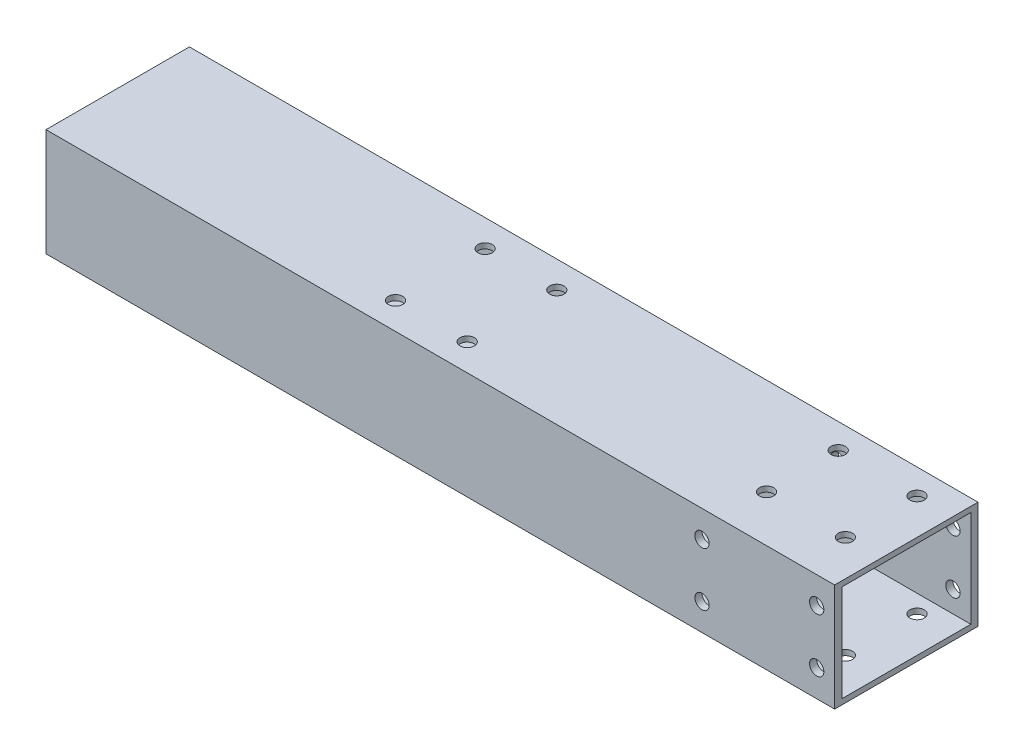
ISO-10303-21;
HEADER;
FILE_DESCRIPTION(('STEP AP214'),'2;1');
FILE_NAME('part.step','',(''),(''),'','','');
FILE_SCHEMA(('AUTOMOTIVE_DESIGN { 1 0 10303 214 1 1 1 1 }'));
ENDSEC;
DATA;
#1=APPLICATION_CONTEXT('core data for automotive mechanical design processes');
#2=APPLICATION_PROTOCOL_DEFINITION('international standard','automotive_design',2000,#1);
#3=PRODUCT_CONTEXT('',#1,'mechanical');
#4=PRODUCT('Part','Part','',(#3));
#5=PRODUCT_RELATED_PRODUCT_CATEGORY('part','',(#4));
#6=PRODUCT_DEFINITION_FORMATION('','',#4);
#7=PRODUCT_DEFINITION_CONTEXT('part definition',#1,'design');
#8=PRODUCT_DEFINITION('design','',#6,#7);
#9=PRODUCT_DEFINITION_SHAPE('','',#8);
#10=(LENGTH_UNIT() NAMED_UNIT(*) SI_UNIT(.MILLI.,.METRE.));
#11=(NAMED_UNIT(*) PLANE_ANGLE_UNIT() SI_UNIT($,.RADIAN.));
#12=(NAMED_UNIT(*) SI_UNIT($,.STERADIAN.) SOLID_ANGLE_UNIT());
#13=UNCERTAINTY_MEASURE_WITH_UNIT(LENGTH_MEASURE(1.E-05),#10,'distance_accuracy_value','');
#14=(GEOMETRIC_REPRESENTATION_CONTEXT(3) GLOBAL_UNCERTAINTY_ASSIGNED_CONTEXT((#13)) GLOBAL_UNIT_ASSIGNED_CONTEXT((#10,
#11,#12)) REPRESENTATION_CONTEXT('',''));
#15=CARTESIAN_POINT('',(0.,0.,0.));
#16=DIRECTION('',(0.,0.,1.));
#17=DIRECTION('',(1.,0.,0.));
#18=AXIS2_PLACEMENT_3D('',#15,#16,#17);
#19=CARTESIAN_POINT('',(220.,0.,0.));
#20=DIRECTION('',(1.,0.,0.));
#21=DIRECTION('',(0.,0.,-1.));
#22=AXIS2_PLACEMENT_3D('',#19,#20,#21);
#23=PLANE('',#22);
#24=DIRECTION('',(0.,-1.,0.));
#25=VECTOR('',#24,1.);
#26=CARTESIAN_POINT('',(220.,-15.,20.));
#27=LINE('',#26,#25);
#28=CARTESIAN_POINT('',(220.,15.,20.));
#29=VERTEX_POINT('',#28);
#30=CARTESIAN_POINT('',(220.,-15.,20.));
#31=VERTEX_POINT('',#30);
#32=EDGE_CURVE('E156',#29,#31,#27,.T.);
#33=ORIENTED_EDGE('',*,*,#32,.T.);
#34=DIRECTION('',(0.,0.,-1.));
#35=VECTOR('',#34,1.);
#36=CARTESIAN_POINT('',(220.,-15.,-20.));
#37=LINE('',#36,#35);
#38=CARTESIAN_POINT('',(220.,-15.,-20.));
#39=VERTEX_POINT('',#38);
#40=EDGE_CURVE('E160',#31,#39,#37,.T.);
#41=ORIENTED_EDGE('',*,*,#40,.T.);
#42=DIRECTION('',(0.,1.,0.));
#43=VECTOR('',#42,1.);
#44=CARTESIAN_POINT('',(220.,-15.,-20.));
#45=LINE('',#44,#43);
#46=CARTESIAN_POINT('',(220.,15.,-20.));
#47=VERTEX_POINT('',#46);
#48=EDGE_CURVE('E164',#39,#47,#45,.T.);
#49=ORIENTED_EDGE('',*,*,#48,.T.);
#50=DIRECTION('',(0.,0.,1.));
#51=VECTOR('',#50,1.);
#52=CARTESIAN_POINT('',(220.,15.,-20.));
#53=LINE('',#52,#51);
#54=EDGE_CURVE('E167',#47,#29,#53,.T.);
#55=ORIENTED_EDGE('',*,*,#54,.T.);
#56=EDGE_LOOP('',(#33,#41,#49,#55));
#57=FACE_BOUND('',#56,.T.);
#58=DIRECTION('',(0.,0.,-1.));
#59=VECTOR('',#58,1.);
#60=CARTESIAN_POINT('',(220.,-13.5,-18.));
#61=LINE('',#60,#59);
#62=CARTESIAN_POINT('',(220.,-13.5,18.));
#63=VERTEX_POINT('',#62);
#64=CARTESIAN_POINT('',(220.,-13.5,-18.));
#65=VERTEX_POINT('',#64);
#66=EDGE_CURVE('E115',#63,#65,#61,.T.);
#67=ORIENTED_EDGE('',*,*,#66,.F.);
#68=DIRECTION('',(0.,-1.,0.));
#69=VECTOR('',#68,1.);
#70=CARTESIAN_POINT('',(220.,-13.5,18.));
#71=LINE('',#70,#69);
#72=CARTESIAN_POINT('',(220.,13.5,18.));
#73=VERTEX_POINT('',#72);
#74=EDGE_CURVE('E106',#73,#63,#71,.T.);
#75=ORIENTED_EDGE('',*,*,#74,.F.);
#76=DIRECTION('',(0.,0.,1.));
#77=VECTOR('',#76,1.);
#78=CARTESIAN_POINT('',(220.,13.5,-18.));
#79=LINE('',#78,#77);
#80=CARTESIAN_POINT('',(220.,13.5,-18.));
#81=VERTEX_POINT('',#80);
#82=EDGE_CURVE('E132',#81,#73,#79,.T.);
#83=ORIENTED_EDGE('',*,*,#82,.F.);
#84=DIRECTION('',(0.,1.,0.));
#85=VECTOR('',#84,1.);
#86=CARTESIAN_POINT('',(220.,-13.5,-18.));
#87=LINE('',#86,#85);
#88=EDGE_CURVE('E128',#65,#81,#87,.T.);
#89=ORIENTED_EDGE('',*,*,#88,.F.);
#90=EDGE_LOOP('',(#67,#75,#83,#89));
#91=FACE_BOUND('',#90,.T.);
#92=ADVANCED_FACE('F38',(#57,#91),#23,.T.);
#93=CARTESIAN_POINT('',(0.,0.,0.));
#94=DIRECTION('',(1.,0.,0.));
#95=DIRECTION('',(0.,0.,-1.));
#96=AXIS2_PLACEMENT_3D('',#93,#94,#95);
#97=PLANE('',#96);
#98=DIRECTION('',(0.,-1.,0.));
#99=VECTOR('',#98,1.);
#100=CARTESIAN_POINT('',(0.,-15.,20.));
#101=LINE('',#100,#99);
#102=CARTESIAN_POINT('',(0.,15.,20.));
#103=VERTEX_POINT('',#102);
#104=CARTESIAN_POINT('',(0.,-15.,20.));
#105=VERTEX_POINT('',#104);
#106=EDGE_CURVE('E124',#103,#105,#101,.T.);
#107=ORIENTED_EDGE('',*,*,#106,.F.);
#108=DIRECTION('',(0.,0.,1.));
#109=VECTOR('',#108,1.);
#110=CARTESIAN_POINT('',(0.,15.,-20.));
#111=LINE('',#110,#109);
#112=CARTESIAN_POINT('',(0.,15.,-20.));
#113=VERTEX_POINT('',#112);
#114=EDGE_CURVE('E161',#113,#103,#111,.T.);
#115=ORIENTED_EDGE('',*,*,#114,.F.);
#116=DIRECTION('',(0.,1.,0.));
#117=VECTOR('',#116,1.);
#118=CARTESIAN_POINT('',(0.,-15.,-20.));
#119=LINE('',#118,#117);
#120=CARTESIAN_POINT('',(0.,-15.,-20.));
#121=VERTEX_POINT('',#120);
#122=EDGE_CURVE('E177',#121,#113,#119,.T.);
#123=ORIENTED_EDGE('',*,*,#122,.F.);
#124=DIRECTION('',(0.,0.,-1.));
#125=VECTOR('',#124,1.);
#126=CARTESIAN_POINT('',(0.,-15.,-20.));
#127=LINE('',#126,#125);
#128=EDGE_CURVE('E174',#105,#121,#127,.T.);
#129=ORIENTED_EDGE('',*,*,#128,.F.);
#130=EDGE_LOOP('',(#107,#115,#123,#129));
#131=FACE_BOUND('',#130,.T.);
#132=DIRECTION('',(0.,-1.,0.));
#133=VECTOR('',#132,1.);
#134=CARTESIAN_POINT('',(0.,-13.5,18.));
#135=LINE('',#134,#133);
#136=CARTESIAN_POINT('',(0.,13.5,18.));
#137=VERTEX_POINT('',#136);
#138=CARTESIAN_POINT('',(0.,-13.5,18.));
#139=VERTEX_POINT('',#138);
#140=EDGE_CURVE('E64',#137,#139,#135,.T.);
#141=ORIENTED_EDGE('',*,*,#140,.T.);
#142=DIRECTION('',(0.,0.,-1.));
#143=VECTOR('',#142,1.);
#144=CARTESIAN_POINT('',(0.,-13.5,-18.));
#145=LINE('',#144,#143);
#146=CARTESIAN_POINT('',(0.,-13.5,-18.));
#147=VERTEX_POINT('',#146);
#148=EDGE_CURVE('E122',#139,#147,#145,.T.);
#149=ORIENTED_EDGE('',*,*,#148,.T.);
#150=DIRECTION('',(0.,1.,0.));
#151=VECTOR('',#150,1.);
#152=CARTESIAN_POINT('',(0.,-13.5,-18.));
#153=LINE('',#152,#151);
#154=CARTESIAN_POINT('',(0.,13.5,-18.));
#155=VERTEX_POINT('',#154);
#156=EDGE_CURVE('E143',#147,#155,#153,.T.);
#157=ORIENTED_EDGE('',*,*,#156,.T.);
#158=DIRECTION('',(0.,0.,1.));
#159=VECTOR('',#158,1.);
#160=CARTESIAN_POINT('',(0.,13.5,-18.));
#161=LINE('',#160,#159);
#162=EDGE_CURVE('E116',#155,#137,#161,.T.);
#163=ORIENTED_EDGE('',*,*,#162,.T.);
#164=EDGE_LOOP('',(#141,#149,#157,#163));
#165=FACE_BOUND('',#164,.T.);
#166=ADVANCED_FACE('F384',(#131,#165),#97,.F.);
#167=CARTESIAN_POINT('',(220.,-15.,20.));
#168=DIRECTION('',(0.,0.,-1.));
#169=DIRECTION('',(-1.,0.,0.));
#170=AXIS2_PLACEMENT_3D('',#167,#168,#169);
#171=PLANE('',#170);
#172=CARTESIAN_POINT('',(215.,7.5,20.));
#173=DIRECTION('',(0.,0.,1.));
#174=DIRECTION('',(1.,0.,0.));
#175=AXIS2_PLACEMENT_3D('',#172,#173,#174);
#176=CIRCLE('',#175,2.);
#177=CARTESIAN_POINT('',(217.,7.5,20.));
#178=VERTEX_POINT('',#177);
#179=EDGE_CURVE('E519',#178,#178,#176,.T.);
#180=ORIENTED_EDGE('',*,*,#179,.F.);
#181=EDGE_LOOP('',(#180));
#182=FACE_BOUND('',#181,.T.);
#183=CARTESIAN_POINT('',(215.,-7.5,20.));
#184=DIRECTION('',(0.,0.,1.));
#185=DIRECTION('',(1.,0.,0.));
#186=AXIS2_PLACEMENT_3D('',#183,#184,#185);
#187=CIRCLE('',#186,2.);
#188=CARTESIAN_POINT('',(217.,-7.5,20.));
#189=VERTEX_POINT('',#188);
#190=EDGE_CURVE('E528',#189,#189,#187,.T.);
#191=ORIENTED_EDGE('',*,*,#190,.F.);
#192=EDGE_LOOP('',(#191));
#193=FACE_BOUND('',#192,.T.);
#194=CARTESIAN_POINT('',(183.,-7.5,20.));
#195=DIRECTION('',(0.,0.,1.));
#196=DIRECTION('',(1.,0.,0.));
#197=AXIS2_PLACEMENT_3D('',#194,#195,#196);
#198=CIRCLE('',#197,2.);
#199=CARTESIAN_POINT('',(185.,-7.5,20.));
#200=VERTEX_POINT('',#199);
#201=EDGE_CURVE('E261',#200,#200,#198,.T.);
#202=ORIENTED_EDGE('',*,*,#201,.F.);
#203=EDGE_LOOP('',(#202));
#204=FACE_BOUND('',#203,.T.);
#205=CARTESIAN_POINT('',(183.,7.5,20.));
#206=DIRECTION('',(0.,0.,1.));
#207=DIRECTION('',(1.,0.,0.));
#208=AXIS2_PLACEMENT_3D('',#205,#206,#207);
#209=CIRCLE('',#208,2.);
#210=CARTESIAN_POINT('',(185.,7.5,20.));
#211=VERTEX_POINT('',#210);
#212=EDGE_CURVE('E268',#211,#211,#209,.T.);
#213=ORIENTED_EDGE('',*,*,#212,.F.);
#214=EDGE_LOOP('',(#213));
#215=FACE_BOUND('',#214,.T.);
#216=ORIENTED_EDGE('',*,*,#106,.T.);
#217=DIRECTION('',(-1.,0.,0.));
#218=VECTOR('',#217,1.);
#219=CARTESIAN_POINT('',(220.,-15.,20.));
#220=LINE('',#219,#218);
#221=EDGE_CURVE('E11',#31,#105,#220,.T.);
#222=ORIENTED_EDGE('',*,*,#221,.F.);
#223=ORIENTED_EDGE('',*,*,#32,.F.);
#224=DIRECTION('',(-1.,0.,0.));
#225=VECTOR('',#224,1.);
#226=CARTESIAN_POINT('',(220.,15.,20.));
#227=LINE('',#226,#225);
#228=EDGE_CURVE('E170',#29,#103,#227,.T.);
#229=ORIENTED_EDGE('',*,*,#228,.T.);
#230=EDGE_LOOP('',(#216,#222,#223,#229));
#231=FACE_BOUND('',#230,.T.);
#232=ADVANCED_FACE('F40',(#182,#193,#204,#215,#231),#171,.F.);
#233=CARTESIAN_POINT('',(220.,-15.,-20.));
#234=DIRECTION('',(0.,1.,0.));
#235=DIRECTION('',(0.,0.,1.));
#236=AXIS2_PLACEMENT_3D('',#233,#234,#235);
#237=PLANE('',#236);
#238=CARTESIAN_POINT('',(110.,-15.,-12.5));
#239=DIRECTION('',(0.,1.,0.));
#240=DIRECTION('',(0.,0.,1.));
#241=AXIS2_PLACEMENT_3D('',#238,#239,#240);
#242=CIRCLE('',#241,2.);
#243=CARTESIAN_POINT('',(110.,-15.,-10.5));
#244=VERTEX_POINT('',#243);
#245=EDGE_CURVE('E224',#244,#244,#242,.T.);
#246=ORIENTED_EDGE('',*,*,#245,.T.);
#247=EDGE_LOOP('',(#246));
#248=FACE_BOUND('',#247,.T.);
#249=CARTESIAN_POINT('',(110.,-15.,12.5));
#250=DIRECTION('',(0.,1.,0.));
#251=DIRECTION('',(0.,0.,1.));
#252=AXIS2_PLACEMENT_3D('',#249,#250,#251);
#253=CIRCLE('',#252,2.);
#254=CARTESIAN_POINT('',(110.,-15.,14.5));
#255=VERTEX_POINT('',#254);
#256=EDGE_CURVE('E286',#255,#255,#253,.T.);
#257=ORIENTED_EDGE('',*,*,#256,.T.);
#258=EDGE_LOOP('',(#257));
#259=FACE_BOUND('',#258,.T.);
#260=CARTESIAN_POINT('',(90.,-15.,12.5));
#261=DIRECTION('',(0.,1.,0.));
#262=DIRECTION('',(0.,0.,1.));
#263=AXIS2_PLACEMENT_3D('',#260,#261,#262);
#264=CIRCLE('',#263,2.);
#265=CARTESIAN_POINT('',(90.,-15.,14.5));
#266=VERTEX_POINT('',#265);
#267=EDGE_CURVE('E294',#266,#266,#264,.T.);
#268=ORIENTED_EDGE('',*,*,#267,.T.);
#269=EDGE_LOOP('',(#268));
#270=FACE_BOUND('',#269,.T.);
#271=CARTESIAN_POINT('',(90.,-15.,-12.5));
#272=DIRECTION('',(0.,1.,0.));
#273=DIRECTION('',(0.,0.,1.));
#274=AXIS2_PLACEMENT_3D('',#271,#272,#273);
#275=CIRCLE('',#274,2.);
#276=CARTESIAN_POINT('',(90.,-15.,-10.5));
#277=VERTEX_POINT('',#276);
#278=EDGE_CURVE('E218',#277,#277,#275,.T.);
#279=ORIENTED_EDGE('',*,*,#278,.T.);
#280=EDGE_LOOP('',(#279));
#281=FACE_BOUND('',#280,.T.);
#282=CARTESIAN_POINT('',(210.,-15.,-13.));
#283=DIRECTION('',(0.,1.,0.));
#284=DIRECTION('',(0.,0.,1.));
#285=AXIS2_PLACEMENT_3D('',#282,#283,#284);
#286=CIRCLE('',#285,2.);
#287=CARTESIAN_POINT('',(210.,-15.,-11.));
#288=VERTEX_POINT('',#287);
#289=EDGE_CURVE('E202',#288,#288,#286,.T.);
#290=ORIENTED_EDGE('',*,*,#289,.T.);
#291=EDGE_LOOP('',(#290));
#292=FACE_BOUND('',#291,.T.);
#293=CARTESIAN_POINT('',(188.,-15.,-13.));
#294=DIRECTION('',(0.,1.,0.));
#295=DIRECTION('',(0.,0.,1.));
#296=AXIS2_PLACEMENT_3D('',#293,#294,#295);
#297=CIRCLE('',#296,2.);
#298=CARTESIAN_POINT('',(188.,-15.,-11.));
#299=VERTEX_POINT('',#298);
#300=EDGE_CURVE('E328',#299,#299,#297,.T.);
#301=ORIENTED_EDGE('',*,*,#300,.T.);
#302=EDGE_LOOP('',(#301));
#303=FACE_BOUND('',#302,.T.);
#304=CARTESIAN_POINT('',(188.,-15.,7.00000000000001));
#305=DIRECTION('',(0.,1.,0.));
#306=DIRECTION('',(0.,0.,1.));
#307=AXIS2_PLACEMENT_3D('',#304,#305,#306);
#308=CIRCLE('',#307,2.);
#309=CARTESIAN_POINT('',(188.,-15.,9.00000000000001));
#310=VERTEX_POINT('',#309);
#311=EDGE_CURVE('E336',#310,#310,#308,.T.);
#312=ORIENTED_EDGE('',*,*,#311,.T.);
#313=EDGE_LOOP('',(#312));
#314=FACE_BOUND('',#313,.T.);
#315=CARTESIAN_POINT('',(210.,-15.,7.00000000000001));
#316=DIRECTION('',(0.,1.,0.));
#317=DIRECTION('',(0.,0.,1.));
#318=AXIS2_PLACEMENT_3D('',#315,#316,#317);
#319=CIRCLE('',#318,2.);
#320=CARTESIAN_POINT('',(210.,-15.,9.00000000000001));
#321=VERTEX_POINT('',#320);
#322=EDGE_CURVE('E196',#321,#321,#319,.T.);
#323=ORIENTED_EDGE('',*,*,#322,.T.);
#324=EDGE_LOOP('',(#323));
#325=FACE_BOUND('',#324,.T.);
#326=ORIENTED_EDGE('',*,*,#128,.T.);
#327=DIRECTION('',(-1.,0.,0.));
#328=VECTOR('',#327,1.);
#329=CARTESIAN_POINT('',(220.,-15.,-20.));
#330=LINE('',#329,#328);
#331=EDGE_CURVE('E48',#39,#121,#330,.T.);
#332=ORIENTED_EDGE('',*,*,#331,.F.);
#333=ORIENTED_EDGE('',*,*,#40,.F.);
#334=ORIENTED_EDGE('',*,*,#221,.T.);
#335=EDGE_LOOP('',(#326,#332,#333,#334));
#336=FACE_BOUND('',#335,.T.);
#337=ADVANCED_FACE('F398',(#248,#259,#270,#281,#292,#303,#314,#325,#336),#237,.F.);
#338=CARTESIAN_POINT('',(220.,-15.,-20.));
#339=DIRECTION('',(0.,0.,1.));
#340=DIRECTION('',(1.,0.,0.));
#341=AXIS2_PLACEMENT_3D('',#338,#339,#340);
#342=PLANE('',#341);
#343=CARTESIAN_POINT('',(215.,7.5,-20.));
#344=DIRECTION('',(0.,0.,1.));
#345=DIRECTION('',(1.,0.,0.));
#346=AXIS2_PLACEMENT_3D('',#343,#344,#345);
#347=CIRCLE('',#346,2.);
#348=CARTESIAN_POINT('',(217.,7.5,-20.));
#349=VERTEX_POINT('',#348);
#350=EDGE_CURVE('E245',#349,#349,#347,.T.);
#351=ORIENTED_EDGE('',*,*,#350,.T.);
#352=EDGE_LOOP('',(#351));
#353=FACE_BOUND('',#352,.T.);
#354=CARTESIAN_POINT('',(215.,-7.5,-20.));
#355=DIRECTION('',(0.,0.,1.));
#356=DIRECTION('',(1.,0.,0.));
#357=AXIS2_PLACEMENT_3D('',#354,#355,#356);
#358=CIRCLE('',#357,2.);
#359=CARTESIAN_POINT('',(217.,-7.5,-20.));
#360=VERTEX_POINT('',#359);
#361=EDGE_CURVE('E521',#360,#360,#358,.T.);
#362=ORIENTED_EDGE('',*,*,#361,.T.);
#363=EDGE_LOOP('',(#362));
#364=FACE_BOUND('',#363,.T.);
#365=CARTESIAN_POINT('',(183.,-7.5,-20.));
#366=DIRECTION('',(0.,0.,1.));
#367=DIRECTION('',(1.,0.,0.));
#368=AXIS2_PLACEMENT_3D('',#365,#366,#367);
#369=CIRCLE('',#368,2.);
#370=CARTESIAN_POINT('',(185.,-7.5,-20.));
#371=VERTEX_POINT('',#370);
#372=EDGE_CURVE('E533',#371,#371,#369,.T.);
#373=ORIENTED_EDGE('',*,*,#372,.T.);
#374=EDGE_LOOP('',(#373));
#375=FACE_BOUND('',#374,.T.);
#376=CARTESIAN_POINT('',(183.,7.5,-20.));
#377=DIRECTION('',(0.,0.,1.));
#378=DIRECTION('',(1.,0.,0.));
#379=AXIS2_PLACEMENT_3D('',#376,#377,#378);
#380=CIRCLE('',#379,2.);
#381=CARTESIAN_POINT('',(185.,7.5,-20.));
#382=VERTEX_POINT('',#381);
#383=EDGE_CURVE('E240',#382,#382,#380,.T.);
#384=ORIENTED_EDGE('',*,*,#383,.T.);
#385=EDGE_LOOP('',(#384));
#386=FACE_BOUND('',#385,.T.);
#387=ORIENTED_EDGE('',*,*,#122,.T.);
#388=DIRECTION('',(-1.,0.,0.));
#389=VECTOR('',#388,1.);
#390=CARTESIAN_POINT('',(220.,15.,-20.));
#391=LINE('',#390,#389);
#392=EDGE_CURVE('E185',#47,#113,#391,.T.);
#393=ORIENTED_EDGE('',*,*,#392,.F.);
#394=ORIENTED_EDGE('',*,*,#48,.F.);
#395=ORIENTED_EDGE('',*,*,#331,.T.);
#396=EDGE_LOOP('',(#387,#393,#394,#395));
#397=FACE_BOUND('',#396,.T.);
#398=ADVANCED_FACE('F395',(#353,#364,#375,#386,#397),#342,.F.);
#399=CARTESIAN_POINT('',(220.,15.,-20.));
#400=DIRECTION('',(0.,-1.,0.));
#401=DIRECTION('',(0.,0.,-1.));
#402=AXIS2_PLACEMENT_3D('',#399,#400,#401);
#403=PLANE('',#402);
#404=CARTESIAN_POINT('',(110.,15.,-12.5));
#405=DIRECTION('',(0.,1.,0.));
#406=DIRECTION('',(0.,0.,1.));
#407=AXIS2_PLACEMENT_3D('',#404,#405,#406);
#408=CIRCLE('',#407,2.);
#409=CARTESIAN_POINT('',(110.,15.,-10.5));
#410=VERTEX_POINT('',#409);
#411=EDGE_CURVE('E282',#410,#410,#408,.T.);
#412=ORIENTED_EDGE('',*,*,#411,.F.);
#413=EDGE_LOOP('',(#412));
#414=FACE_BOUND('',#413,.T.);
#415=CARTESIAN_POINT('',(110.,15.,12.5));
#416=DIRECTION('',(0.,1.,0.));
#417=DIRECTION('',(0.,0.,1.));
#418=AXIS2_PLACEMENT_3D('',#415,#416,#417);
#419=CIRCLE('',#418,2.);
#420=CARTESIAN_POINT('',(110.,15.,14.5));
#421=VERTEX_POINT('',#420);
#422=EDGE_CURVE('E290',#421,#421,#419,.T.);
#423=ORIENTED_EDGE('',*,*,#422,.F.);
#424=EDGE_LOOP('',(#423));
#425=FACE_BOUND('',#424,.T.);
#426=CARTESIAN_POINT('',(90.,15.,12.5));
#427=DIRECTION('',(0.,1.,0.));
#428=DIRECTION('',(0.,0.,1.));
#429=AXIS2_PLACEMENT_3D('',#426,#427,#428);
#430=CIRCLE('',#429,2.);
#431=CARTESIAN_POINT('',(90.,15.,14.5));
#432=VERTEX_POINT('',#431);
#433=EDGE_CURVE('E278',#432,#432,#430,.T.);
#434=ORIENTED_EDGE('',*,*,#433,.F.);
#435=EDGE_LOOP('',(#434));
#436=FACE_BOUND('',#435,.T.);
#437=CARTESIAN_POINT('',(90.,15.,-12.5));
#438=DIRECTION('',(0.,1.,0.));
#439=DIRECTION('',(0.,0.,1.));
#440=AXIS2_PLACEMENT_3D('',#437,#438,#439);
#441=CIRCLE('',#440,2.);
#442=CARTESIAN_POINT('',(90.,15.,-10.5));
#443=VERTEX_POINT('',#442);
#444=EDGE_CURVE('E310',#443,#443,#441,.T.);
#445=ORIENTED_EDGE('',*,*,#444,.F.);
#446=EDGE_LOOP('',(#445));
#447=FACE_BOUND('',#446,.T.);
#448=CARTESIAN_POINT('',(210.,15.,-13.));
#449=DIRECTION('',(0.,1.,0.));
#450=DIRECTION('',(0.,0.,1.));
#451=AXIS2_PLACEMENT_3D('',#448,#449,#450);
#452=CIRCLE('',#451,2.);
#453=CARTESIAN_POINT('',(210.,15.,-11.));
#454=VERTEX_POINT('',#453);
#455=EDGE_CURVE('E324',#454,#454,#452,.T.);
#456=ORIENTED_EDGE('',*,*,#455,.F.);
#457=EDGE_LOOP('',(#456));
#458=FACE_BOUND('',#457,.T.);
#459=CARTESIAN_POINT('',(188.,15.,-13.));
#460=DIRECTION('',(0.,1.,0.));
#461=DIRECTION('',(0.,0.,1.));
#462=AXIS2_PLACEMENT_3D('',#459,#460,#461);
#463=CIRCLE('',#462,2.);
#464=CARTESIAN_POINT('',(188.,15.,-11.));
#465=VERTEX_POINT('',#464);
#466=EDGE_CURVE('E332',#465,#465,#463,.T.);
#467=ORIENTED_EDGE('',*,*,#466,.F.);
#468=EDGE_LOOP('',(#467));
#469=FACE_BOUND('',#468,.T.);
#470=CARTESIAN_POINT('',(188.,15.,7.00000000000001));
#471=DIRECTION('',(0.,1.,0.));
#472=DIRECTION('',(0.,0.,1.));
#473=AXIS2_PLACEMENT_3D('',#470,#471,#472);
#474=CIRCLE('',#473,2.);
#475=CARTESIAN_POINT('',(188.,15.,9.00000000000001));
#476=VERTEX_POINT('',#475);
#477=EDGE_CURVE('E320',#476,#476,#474,.T.);
#478=ORIENTED_EDGE('',*,*,#477,.F.);
#479=EDGE_LOOP('',(#478));
#480=FACE_BOUND('',#479,.T.);
#481=CARTESIAN_POINT('',(210.,15.,7.00000000000001));
#482=DIRECTION('',(0.,1.,0.));
#483=DIRECTION('',(0.,0.,1.));
#484=AXIS2_PLACEMENT_3D('',#481,#482,#483);
#485=CIRCLE('',#484,2.);
#486=CARTESIAN_POINT('',(210.,15.,9.00000000000001));
#487=VERTEX_POINT('',#486);
#488=EDGE_CURVE('E352',#487,#487,#485,.T.);
#489=ORIENTED_EDGE('',*,*,#488,.F.);
#490=EDGE_LOOP('',(#489));
#491=FACE_BOUND('',#490,.T.);
#492=ORIENTED_EDGE('',*,*,#114,.T.);
#493=ORIENTED_EDGE('',*,*,#228,.F.);
#494=ORIENTED_EDGE('',*,*,#54,.F.);
#495=ORIENTED_EDGE('',*,*,#392,.T.);
#496=EDGE_LOOP('',(#492,#493,#494,#495));
#497=FACE_BOUND('',#496,.T.);
#498=ADVANCED_FACE('F378',(#414,#425,#436,#447,#458,#469,#480,#491,#497),#403,.F.);
#499=CARTESIAN_POINT('',(220.,-13.5,18.));
#500=DIRECTION('',(0.,0.,-1.));
#501=DIRECTION('',(-1.,0.,0.));
#502=AXIS2_PLACEMENT_3D('',#499,#500,#501);
#503=PLANE('',#502);
#504=CARTESIAN_POINT('',(215.,7.5,18.));
#505=DIRECTION('',(0.,0.,-1.));
#506=DIRECTION('',(-1.,0.,0.));
#507=AXIS2_PLACEMENT_3D('',#504,#505,#506);
#508=CIRCLE('',#507,2.);
#509=CARTESIAN_POINT('',(213.,7.5,18.));
#510=VERTEX_POINT('',#509);
#511=EDGE_CURVE('E264',#510,#510,#508,.T.);
#512=ORIENTED_EDGE('',*,*,#511,.F.);
#513=EDGE_LOOP('',(#512));
#514=FACE_BOUND('',#513,.T.);
#515=CARTESIAN_POINT('',(215.,-7.5,18.));
#516=DIRECTION('',(0.,0.,-1.));
#517=DIRECTION('',(-1.,0.,0.));
#518=AXIS2_PLACEMENT_3D('',#515,#516,#517);
#519=CIRCLE('',#518,2.);
#520=CARTESIAN_POINT('',(213.,-7.5,18.));
#521=VERTEX_POINT('',#520);
#522=EDGE_CURVE('E249',#521,#521,#519,.T.);
#523=ORIENTED_EDGE('',*,*,#522,.F.);
#524=EDGE_LOOP('',(#523));
#525=FACE_BOUND('',#524,.T.);
#526=CARTESIAN_POINT('',(183.,-7.5,18.));
#527=DIRECTION('',(0.,0.,-1.));
#528=DIRECTION('',(-1.,0.,0.));
#529=AXIS2_PLACEMENT_3D('',#526,#527,#528);
#530=CIRCLE('',#529,2.);
#531=CARTESIAN_POINT('',(181.,-7.5,18.));
#532=VERTEX_POINT('',#531);
#533=EDGE_CURVE('E244',#532,#532,#530,.T.);
#534=ORIENTED_EDGE('',*,*,#533,.F.);
#535=EDGE_LOOP('',(#534));
#536=FACE_BOUND('',#535,.T.);
#537=CARTESIAN_POINT('',(183.,7.5,18.));
#538=DIRECTION('',(0.,0.,-1.));
#539=DIRECTION('',(-1.,0.,0.));
#540=AXIS2_PLACEMENT_3D('',#537,#538,#539);
#541=CIRCLE('',#540,2.);
#542=CARTESIAN_POINT('',(181.,7.5,18.));
#543=VERTEX_POINT('',#542);
#544=EDGE_CURVE('E239',#543,#543,#541,.T.);
#545=ORIENTED_EDGE('',*,*,#544,.F.);
#546=EDGE_LOOP('',(#545));
#547=FACE_BOUND('',#546,.T.);
#548=ORIENTED_EDGE('',*,*,#140,.F.);
#549=DIRECTION('',(-1.,0.,0.));
#550=VECTOR('',#549,1.);
#551=CARTESIAN_POINT('',(220.,13.5,18.));
#552=LINE('',#551,#550);
#553=EDGE_CURVE('E110',#73,#137,#552,.T.);
#554=ORIENTED_EDGE('',*,*,#553,.F.);
#555=ORIENTED_EDGE('',*,*,#74,.T.);
#556=DIRECTION('',(-1.,0.,0.));
#557=VECTOR('',#556,1.);
#558=CARTESIAN_POINT('',(220.,-13.5,18.));
#559=LINE('',#558,#557);
#560=EDGE_CURVE('E109',#63,#139,#559,.T.);
#561=ORIENTED_EDGE('',*,*,#560,.T.);
#562=EDGE_LOOP('',(#548,#554,#555,#561));
#563=FACE_BOUND('',#562,.T.);
#564=ADVANCED_FACE('F108',(#514,#525,#536,#547,#563),#503,.T.);
#565=CARTESIAN_POINT('',(220.,-13.5,-18.));
#566=DIRECTION('',(0.,1.,0.));
#567=DIRECTION('',(0.,0.,1.));
#568=AXIS2_PLACEMENT_3D('',#565,#566,#567);
#569=PLANE('',#568);
#570=CARTESIAN_POINT('',(110.,-13.5,-12.5));
#571=DIRECTION('',(0.,1.,0.));
#572=DIRECTION('',(0.,0.,1.));
#573=AXIS2_PLACEMENT_3D('',#570,#571,#572);
#574=CIRCLE('',#573,2.);
#575=CARTESIAN_POINT('',(110.,-13.5,-10.5));
#576=VERTEX_POINT('',#575);
#577=EDGE_CURVE('E234',#576,#576,#574,.T.);
#578=ORIENTED_EDGE('',*,*,#577,.F.);
#579=EDGE_LOOP('',(#578));
#580=FACE_BOUND('',#579,.T.);
#581=CARTESIAN_POINT('',(110.,-13.5,12.5));
#582=DIRECTION('',(0.,1.,0.));
#583=DIRECTION('',(0.,0.,1.));
#584=AXIS2_PLACEMENT_3D('',#581,#582,#583);
#585=CIRCLE('',#584,2.);
#586=CARTESIAN_POINT('',(110.,-13.5,14.5));
#587=VERTEX_POINT('',#586);
#588=EDGE_CURVE('E229',#587,#587,#585,.T.);
#589=ORIENTED_EDGE('',*,*,#588,.F.);
#590=EDGE_LOOP('',(#589));
#591=FACE_BOUND('',#590,.T.);
#592=CARTESIAN_POINT('',(90.,-13.5,12.5));
#593=DIRECTION('',(0.,1.,0.));
#594=DIRECTION('',(0.,0.,1.));
#595=AXIS2_PLACEMENT_3D('',#592,#593,#594);
#596=CIRCLE('',#595,2.);
#597=CARTESIAN_POINT('',(90.,-13.5,14.5));
#598=VERTEX_POINT('',#597);
#599=EDGE_CURVE('E223',#598,#598,#596,.T.);
#600=ORIENTED_EDGE('',*,*,#599,.F.);
#601=EDGE_LOOP('',(#600));
#602=FACE_BOUND('',#601,.T.);
#603=CARTESIAN_POINT('',(90.,-13.5,-12.5));
#604=DIRECTION('',(0.,1.,0.));
#605=DIRECTION('',(0.,0.,1.));
#606=AXIS2_PLACEMENT_3D('',#603,#604,#605);
#607=CIRCLE('',#606,2.);
#608=CARTESIAN_POINT('',(90.,-13.5,-10.5));
#609=VERTEX_POINT('',#608);
#610=EDGE_CURVE('E217',#609,#609,#607,.T.);
#611=ORIENTED_EDGE('',*,*,#610,.F.);
#612=EDGE_LOOP('',(#611));
#613=FACE_BOUND('',#612,.T.);
#614=CARTESIAN_POINT('',(210.,-13.5,-13.));
#615=DIRECTION('',(0.,1.,0.));
#616=DIRECTION('',(0.,0.,1.));
#617=AXIS2_PLACEMENT_3D('',#614,#615,#616);
#618=CIRCLE('',#617,2.);
#619=CARTESIAN_POINT('',(210.,-13.5,-11.));
#620=VERTEX_POINT('',#619);
#621=EDGE_CURVE('E212',#620,#620,#618,.T.);
#622=ORIENTED_EDGE('',*,*,#621,.F.);
#623=EDGE_LOOP('',(#622));
#624=FACE_BOUND('',#623,.T.);
#625=CARTESIAN_POINT('',(188.,-13.5,-13.));
#626=DIRECTION('',(0.,1.,0.));
#627=DIRECTION('',(0.,0.,1.));
#628=AXIS2_PLACEMENT_3D('',#625,#626,#627);
#629=CIRCLE('',#628,2.);
#630=CARTESIAN_POINT('',(188.,-13.5,-11.));
#631=VERTEX_POINT('',#630);
#632=EDGE_CURVE('E207',#631,#631,#629,.T.);
#633=ORIENTED_EDGE('',*,*,#632,.F.);
#634=EDGE_LOOP('',(#633));
#635=FACE_BOUND('',#634,.T.);
#636=CARTESIAN_POINT('',(188.,-13.5,7.00000000000001));
#637=DIRECTION('',(0.,1.,0.));
#638=DIRECTION('',(0.,0.,1.));
#639=AXIS2_PLACEMENT_3D('',#636,#637,#638);
#640=CIRCLE('',#639,2.);
#641=CARTESIAN_POINT('',(188.,-13.5,9.00000000000001));
#642=VERTEX_POINT('',#641);
#643=EDGE_CURVE('E201',#642,#642,#640,.T.);
#644=ORIENTED_EDGE('',*,*,#643,.F.);
#645=EDGE_LOOP('',(#644));
#646=FACE_BOUND('',#645,.T.);
#647=CARTESIAN_POINT('',(210.,-13.5,7.00000000000001));
#648=DIRECTION('',(0.,1.,0.));
#649=DIRECTION('',(0.,0.,1.));
#650=AXIS2_PLACEMENT_3D('',#647,#648,#649);
#651=CIRCLE('',#650,2.);
#652=CARTESIAN_POINT('',(210.,-13.5,9.00000000000001));
#653=VERTEX_POINT('',#652);
#654=EDGE_CURVE('E140',#653,#653,#651,.T.);
#655=ORIENTED_EDGE('',*,*,#654,.F.);
#656=EDGE_LOOP('',(#655));
#657=FACE_BOUND('',#656,.T.);
#658=ORIENTED_EDGE('',*,*,#148,.F.);
#659=ORIENTED_EDGE('',*,*,#560,.F.);
#660=ORIENTED_EDGE('',*,*,#66,.T.);
#661=DIRECTION('',(-1.,0.,0.));
#662=VECTOR('',#661,1.);
#663=CARTESIAN_POINT('',(220.,-13.5,-18.));
#664=LINE('',#663,#662);
#665=EDGE_CURVE('E125',#65,#147,#664,.T.);
#666=ORIENTED_EDGE('',*,*,#665,.T.);
#667=EDGE_LOOP('',(#658,#659,#660,#666));
#668=FACE_BOUND('',#667,.T.);
#669=ADVANCED_FACE('F119',(#580,#591,#602,#613,#624,#635,#646,#657,#668),#569,.T.);
#670=CARTESIAN_POINT('',(220.,-13.5,-18.));
#671=DIRECTION('',(0.,0.,1.));
#672=DIRECTION('',(1.,0.,0.));
#673=AXIS2_PLACEMENT_3D('',#670,#671,#672);
#674=PLANE('',#673);
#675=CARTESIAN_POINT('',(215.,7.5,-18.));
#676=DIRECTION('',(0.,0.,1.));
#677=DIRECTION('',(1.,0.,0.));
#678=AXIS2_PLACEMENT_3D('',#675,#676,#677);
#679=CIRCLE('',#678,2.);
#680=CARTESIAN_POINT('',(217.,7.5,-18.));
#681=VERTEX_POINT('',#680);
#682=EDGE_CURVE('E42',#681,#681,#679,.T.);
#683=ORIENTED_EDGE('',*,*,#682,.F.);
#684=EDGE_LOOP('',(#683));
#685=FACE_BOUND('',#684,.T.);
#686=CARTESIAN_POINT('',(215.,-7.5,-18.));
#687=DIRECTION('',(0.,0.,1.));
#688=DIRECTION('',(1.,0.,0.));
#689=AXIS2_PLACEMENT_3D('',#686,#687,#688);
#690=CIRCLE('',#689,2.);
#691=CARTESIAN_POINT('',(217.,-7.5,-18.));
#692=VERTEX_POINT('',#691);
#693=EDGE_CURVE('E246',#692,#692,#690,.T.);
#694=ORIENTED_EDGE('',*,*,#693,.F.);
#695=EDGE_LOOP('',(#694));
#696=FACE_BOUND('',#695,.T.);
#697=CARTESIAN_POINT('',(183.,-7.5,-18.));
#698=DIRECTION('',(0.,0.,1.));
#699=DIRECTION('',(1.,0.,0.));
#700=AXIS2_PLACEMENT_3D('',#697,#698,#699);
#701=CIRCLE('',#700,2.);
#702=CARTESIAN_POINT('',(185.,-7.5,-18.));
#703=VERTEX_POINT('',#702);
#704=EDGE_CURVE('E241',#703,#703,#701,.T.);
#705=ORIENTED_EDGE('',*,*,#704,.F.);
#706=EDGE_LOOP('',(#705));
#707=FACE_BOUND('',#706,.T.);
#708=CARTESIAN_POINT('',(183.,7.5,-18.));
#709=DIRECTION('',(0.,0.,1.));
#710=DIRECTION('',(1.,0.,0.));
#711=AXIS2_PLACEMENT_3D('',#708,#709,#710);
#712=CIRCLE('',#711,2.);
#713=CARTESIAN_POINT('',(185.,7.5,-18.));
#714=VERTEX_POINT('',#713);
#715=EDGE_CURVE('E235',#714,#714,#712,.T.);
#716=ORIENTED_EDGE('',*,*,#715,.F.);
#717=EDGE_LOOP('',(#716));
#718=FACE_BOUND('',#717,.T.);
#719=ORIENTED_EDGE('',*,*,#156,.F.);
#720=ORIENTED_EDGE('',*,*,#665,.F.);
#721=ORIENTED_EDGE('',*,*,#88,.T.);
#722=DIRECTION('',(-1.,0.,0.));
#723=VECTOR('',#722,1.);
#724=CARTESIAN_POINT('',(220.,13.5,-18.));
#725=LINE('',#724,#723);
#726=EDGE_CURVE('E56',#81,#155,#725,.T.);
#727=ORIENTED_EDGE('',*,*,#726,.T.);
#728=EDGE_LOOP('',(#719,#720,#721,#727));
#729=FACE_BOUND('',#728,.T.);
#730=ADVANCED_FACE('F366',(#685,#696,#707,#718,#729),#674,.T.);
#731=CARTESIAN_POINT('',(220.,13.5,-18.));
#732=DIRECTION('',(0.,-1.,0.));
#733=DIRECTION('',(0.,0.,-1.));
#734=AXIS2_PLACEMENT_3D('',#731,#732,#733);
#735=PLANE('',#734);
#736=CARTESIAN_POINT('',(110.,13.5,-12.5));
#737=DIRECTION('',(0.,-1.,0.));
#738=DIRECTION('',(0.,0.,-1.));
#739=AXIS2_PLACEMENT_3D('',#736,#737,#738);
#740=CIRCLE('',#739,2.);
#741=CARTESIAN_POINT('',(110.,13.5,-14.5));
#742=VERTEX_POINT('',#741);
#743=EDGE_CURVE('E230',#742,#742,#740,.T.);
#744=ORIENTED_EDGE('',*,*,#743,.F.);
#745=EDGE_LOOP('',(#744));
#746=FACE_BOUND('',#745,.T.);
#747=CARTESIAN_POINT('',(110.,13.5,12.5));
#748=DIRECTION('',(0.,-1.,0.));
#749=DIRECTION('',(0.,0.,-1.));
#750=AXIS2_PLACEMENT_3D('',#747,#748,#749);
#751=CIRCLE('',#750,2.);
#752=CARTESIAN_POINT('',(110.,13.5,10.5));
#753=VERTEX_POINT('',#752);
#754=EDGE_CURVE('E225',#753,#753,#751,.T.);
#755=ORIENTED_EDGE('',*,*,#754,.F.);
#756=EDGE_LOOP('',(#755));
#757=FACE_BOUND('',#756,.T.);
#758=CARTESIAN_POINT('',(90.,13.5,12.5));
#759=DIRECTION('',(0.,-1.,0.));
#760=DIRECTION('',(0.,0.,-1.));
#761=AXIS2_PLACEMENT_3D('',#758,#759,#760);
#762=CIRCLE('',#761,2.);
#763=CARTESIAN_POINT('',(90.,13.5,10.5));
#764=VERTEX_POINT('',#763);
#765=EDGE_CURVE('E219',#764,#764,#762,.T.);
#766=ORIENTED_EDGE('',*,*,#765,.F.);
#767=EDGE_LOOP('',(#766));
#768=FACE_BOUND('',#767,.T.);
#769=CARTESIAN_POINT('',(90.,13.5,-12.5));
#770=DIRECTION('',(0.,-1.,0.));
#771=DIRECTION('',(0.,0.,-1.));
#772=AXIS2_PLACEMENT_3D('',#769,#770,#771);
#773=CIRCLE('',#772,2.);
#774=CARTESIAN_POINT('',(90.,13.5,-14.5));
#775=VERTEX_POINT('',#774);
#776=EDGE_CURVE('E213',#775,#775,#773,.T.);
#777=ORIENTED_EDGE('',*,*,#776,.F.);
#778=EDGE_LOOP('',(#777));
#779=FACE_BOUND('',#778,.T.);
#780=CARTESIAN_POINT('',(210.,13.5,-13.));
#781=DIRECTION('',(0.,-1.,0.));
#782=DIRECTION('',(0.,0.,-1.));
#783=AXIS2_PLACEMENT_3D('',#780,#781,#782);
#784=CIRCLE('',#783,2.);
#785=CARTESIAN_POINT('',(210.,13.5,-15.));
#786=VERTEX_POINT('',#785);
#787=EDGE_CURVE('E208',#786,#786,#784,.T.);
#788=ORIENTED_EDGE('',*,*,#787,.F.);
#789=EDGE_LOOP('',(#788));
#790=FACE_BOUND('',#789,.T.);
#791=CARTESIAN_POINT('',(188.,13.5,-13.));
#792=DIRECTION('',(0.,-1.,0.));
#793=DIRECTION('',(0.,0.,-1.));
#794=AXIS2_PLACEMENT_3D('',#791,#792,#793);
#795=CIRCLE('',#794,2.);
#796=CARTESIAN_POINT('',(188.,13.5,-15.));
#797=VERTEX_POINT('',#796);
#798=EDGE_CURVE('E203',#797,#797,#795,.T.);
#799=ORIENTED_EDGE('',*,*,#798,.F.);
#800=EDGE_LOOP('',(#799));
#801=FACE_BOUND('',#800,.T.);
#802=CARTESIAN_POINT('',(188.,13.5,7.00000000000001));
#803=DIRECTION('',(0.,-1.,0.));
#804=DIRECTION('',(0.,0.,-1.));
#805=AXIS2_PLACEMENT_3D('',#802,#803,#804);
#806=CIRCLE('',#805,2.);
#807=CARTESIAN_POINT('',(188.,13.5,5.00000000000002));
#808=VERTEX_POINT('',#807);
#809=EDGE_CURVE('E197',#808,#808,#806,.T.);
#810=ORIENTED_EDGE('',*,*,#809,.F.);
#811=EDGE_LOOP('',(#810));
#812=FACE_BOUND('',#811,.T.);
#813=CARTESIAN_POINT('',(210.,13.5,7.00000000000001));
#814=DIRECTION('',(0.,-1.,0.));
#815=DIRECTION('',(0.,0.,-1.));
#816=AXIS2_PLACEMENT_3D('',#813,#814,#815);
#817=CIRCLE('',#816,2.);
#818=CARTESIAN_POINT('',(210.,13.5,5.00000000000002));
#819=VERTEX_POINT('',#818);
#820=EDGE_CURVE('E192',#819,#819,#817,.T.);
#821=ORIENTED_EDGE('',*,*,#820,.F.);
#822=EDGE_LOOP('',(#821));
#823=FACE_BOUND('',#822,.T.);
#824=ORIENTED_EDGE('',*,*,#162,.F.);
#825=ORIENTED_EDGE('',*,*,#726,.F.);
#826=ORIENTED_EDGE('',*,*,#82,.T.);
#827=ORIENTED_EDGE('',*,*,#553,.T.);
#828=EDGE_LOOP('',(#824,#825,#826,#827));
#829=FACE_BOUND('',#828,.T.);
#830=ADVANCED_FACE('F374',(#746,#757,#768,#779,#790,#801,#812,#823,#829),#735,.T.);
#831=CARTESIAN_POINT('',(210.,-15.,7.00000000000001));
#832=DIRECTION('',(0.,1.,0.));
#833=DIRECTION('',(0.,0.,1.));
#834=AXIS2_PLACEMENT_3D('',#831,#832,#833);
#835=CYLINDRICAL_SURFACE('',#834,2.);
#836=ORIENTED_EDGE('',*,*,#820,.T.);
#837=EDGE_LOOP('',(#836));
#838=FACE_BOUND('',#837,.T.);
#839=ORIENTED_EDGE('',*,*,#488,.T.);
#840=EDGE_LOOP('',(#839));
#841=FACE_BOUND('',#840,.T.);
#842=ADVANCED_FACE('F440',(#838,#841),#835,.F.);
#843=ORIENTED_EDGE('',*,*,#654,.T.);
#844=EDGE_LOOP('',(#843));
#845=FACE_BOUND('',#844,.T.);
#846=ORIENTED_EDGE('',*,*,#322,.F.);
#847=EDGE_LOOP('',(#846));
#848=FACE_BOUND('',#847,.T.);
#849=ADVANCED_FACE('F362',(#845,#848),#835,.F.);
#850=CARTESIAN_POINT('',(188.,-15.,7.00000000000001));
#851=DIRECTION('',(0.,1.,0.));
#852=DIRECTION('',(0.,0.,1.));
#853=AXIS2_PLACEMENT_3D('',#850,#851,#852);
#854=CYLINDRICAL_SURFACE('',#853,2.);
#855=ORIENTED_EDGE('',*,*,#809,.T.);
#856=EDGE_LOOP('',(#855));
#857=FACE_BOUND('',#856,.T.);
#858=ORIENTED_EDGE('',*,*,#477,.T.);
#859=EDGE_LOOP('',(#858));
#860=FACE_BOUND('',#859,.T.);
#861=ADVANCED_FACE('F451',(#857,#860),#854,.F.);
#862=CARTESIAN_POINT('',(188.,-15.,-13.));
#863=DIRECTION('',(0.,1.,0.));
#864=DIRECTION('',(0.,0.,1.));
#865=AXIS2_PLACEMENT_3D('',#862,#863,#864);
#866=CYLINDRICAL_SURFACE('',#865,2.);
#867=ORIENTED_EDGE('',*,*,#798,.T.);
#868=EDGE_LOOP('',(#867));
#869=FACE_BOUND('',#868,.T.);
#870=ORIENTED_EDGE('',*,*,#466,.T.);
#871=EDGE_LOOP('',(#870));
#872=FACE_BOUND('',#871,.T.);
#873=ADVANCED_FACE('F454',(#869,#872),#866,.F.);
#874=CARTESIAN_POINT('',(210.,-15.,-13.));
#875=DIRECTION('',(0.,1.,0.));
#876=DIRECTION('',(0.,0.,1.));
#877=AXIS2_PLACEMENT_3D('',#874,#875,#876);
#878=CYLINDRICAL_SURFACE('',#877,2.);
#879=ORIENTED_EDGE('',*,*,#787,.T.);
#880=EDGE_LOOP('',(#879));
#881=FACE_BOUND('',#880,.T.);
#882=ORIENTED_EDGE('',*,*,#455,.T.);
#883=EDGE_LOOP('',(#882));
#884=FACE_BOUND('',#883,.T.);
#885=ADVANCED_FACE('F459',(#881,#884),#878,.F.);
#886=ORIENTED_EDGE('',*,*,#643,.T.);
#887=EDGE_LOOP('',(#886));
#888=FACE_BOUND('',#887,.T.);
#889=ORIENTED_EDGE('',*,*,#311,.F.);
#890=EDGE_LOOP('',(#889));
#891=FACE_BOUND('',#890,.T.);
#892=ADVANCED_FACE('F456',(#888,#891),#854,.F.);
#893=ORIENTED_EDGE('',*,*,#632,.T.);
#894=EDGE_LOOP('',(#893));
#895=FACE_BOUND('',#894,.T.);
#896=ORIENTED_EDGE('',*,*,#300,.F.);
#897=EDGE_LOOP('',(#896));
#898=FACE_BOUND('',#897,.T.);
#899=ADVANCED_FACE('F461',(#895,#898),#866,.F.);
#900=ORIENTED_EDGE('',*,*,#621,.T.);
#901=EDGE_LOOP('',(#900));
#902=FACE_BOUND('',#901,.T.);
#903=ORIENTED_EDGE('',*,*,#289,.F.);
#904=EDGE_LOOP('',(#903));
#905=FACE_BOUND('',#904,.T.);
#906=ADVANCED_FACE('F465',(#902,#905),#878,.F.);
#907=CARTESIAN_POINT('',(90.,-15.,-12.5));
#908=DIRECTION('',(0.,1.,0.));
#909=DIRECTION('',(0.,0.,1.));
#910=AXIS2_PLACEMENT_3D('',#907,#908,#909);
#911=CYLINDRICAL_SURFACE('',#910,2.);
#912=ORIENTED_EDGE('',*,*,#776,.T.);
#913=EDGE_LOOP('',(#912));
#914=FACE_BOUND('',#913,.T.);
#915=ORIENTED_EDGE('',*,*,#444,.T.);
#916=EDGE_LOOP('',(#915));
#917=FACE_BOUND('',#916,.T.);
#918=ADVANCED_FACE('F466',(#914,#917),#911,.F.);
#919=ORIENTED_EDGE('',*,*,#610,.T.);
#920=EDGE_LOOP('',(#919));
#921=FACE_BOUND('',#920,.T.);
#922=ORIENTED_EDGE('',*,*,#278,.F.);
#923=EDGE_LOOP('',(#922));
#924=FACE_BOUND('',#923,.T.);
#925=ADVANCED_FACE('F469',(#921,#924),#911,.F.);
#926=CARTESIAN_POINT('',(90.,-15.,12.5));
#927=DIRECTION('',(0.,1.,0.));
#928=DIRECTION('',(0.,0.,1.));
#929=AXIS2_PLACEMENT_3D('',#926,#927,#928);
#930=CYLINDRICAL_SURFACE('',#929,2.);
#931=ORIENTED_EDGE('',*,*,#765,.T.);
#932=EDGE_LOOP('',(#931));
#933=FACE_BOUND('',#932,.T.);
#934=ORIENTED_EDGE('',*,*,#433,.T.);
#935=EDGE_LOOP('',(#934));
#936=FACE_BOUND('',#935,.T.);
#937=ADVANCED_FACE('F471',(#933,#936),#930,.F.);
#938=CARTESIAN_POINT('',(110.,-15.,12.5));
#939=DIRECTION('',(0.,1.,0.));
#940=DIRECTION('',(0.,0.,1.));
#941=AXIS2_PLACEMENT_3D('',#938,#939,#940);
#942=CYLINDRICAL_SURFACE('',#941,2.);
#943=ORIENTED_EDGE('',*,*,#754,.T.);
#944=EDGE_LOOP('',(#943));
#945=FACE_BOUND('',#944,.T.);
#946=ORIENTED_EDGE('',*,*,#422,.T.);
#947=EDGE_LOOP('',(#946));
#948=FACE_BOUND('',#947,.T.);
#949=ADVANCED_FACE('F474',(#945,#948),#942,.F.);
#950=CARTESIAN_POINT('',(110.,-15.,-12.5));
#951=DIRECTION('',(0.,1.,0.));
#952=DIRECTION('',(0.,0.,1.));
#953=AXIS2_PLACEMENT_3D('',#950,#951,#952);
#954=CYLINDRICAL_SURFACE('',#953,2.);
#955=ORIENTED_EDGE('',*,*,#743,.T.);
#956=EDGE_LOOP('',(#955));
#957=FACE_BOUND('',#956,.T.);
#958=ORIENTED_EDGE('',*,*,#411,.T.);
#959=EDGE_LOOP('',(#958));
#960=FACE_BOUND('',#959,.T.);
#961=ADVANCED_FACE('F479',(#957,#960),#954,.F.);
#962=ORIENTED_EDGE('',*,*,#599,.T.);
#963=EDGE_LOOP('',(#962));
#964=FACE_BOUND('',#963,.T.);
#965=ORIENTED_EDGE('',*,*,#267,.F.);
#966=EDGE_LOOP('',(#965));
#967=FACE_BOUND('',#966,.T.);
#968=ADVANCED_FACE('F476',(#964,#967),#930,.F.);
#969=ORIENTED_EDGE('',*,*,#588,.T.);
#970=EDGE_LOOP('',(#969));
#971=FACE_BOUND('',#970,.T.);
#972=ORIENTED_EDGE('',*,*,#256,.F.);
#973=EDGE_LOOP('',(#972));
#974=FACE_BOUND('',#973,.T.);
#975=ADVANCED_FACE('F481',(#971,#974),#942,.F.);
#976=ORIENTED_EDGE('',*,*,#577,.T.);
#977=EDGE_LOOP('',(#976));
#978=FACE_BOUND('',#977,.T.);
#979=ORIENTED_EDGE('',*,*,#245,.F.);
#980=EDGE_LOOP('',(#979));
#981=FACE_BOUND('',#980,.T.);
#982=ADVANCED_FACE('F485',(#978,#981),#954,.F.);
#983=CARTESIAN_POINT('',(183.,7.5,-20.));
#984=DIRECTION('',(0.,0.,1.));
#985=DIRECTION('',(1.,0.,0.));
#986=AXIS2_PLACEMENT_3D('',#983,#984,#985);
#987=CYLINDRICAL_SURFACE('',#986,2.);
#988=ORIENTED_EDGE('',*,*,#715,.T.);
#989=EDGE_LOOP('',(#988));
#990=FACE_BOUND('',#989,.T.);
#991=ORIENTED_EDGE('',*,*,#383,.F.);
#992=EDGE_LOOP('',(#991));
#993=FACE_BOUND('',#992,.T.);
#994=ADVANCED_FACE('F486',(#990,#993),#987,.F.);
#995=ORIENTED_EDGE('',*,*,#544,.T.);
#996=EDGE_LOOP('',(#995));
#997=FACE_BOUND('',#996,.T.);
#998=ORIENTED_EDGE('',*,*,#212,.T.);
#999=EDGE_LOOP('',(#998));
#1000=FACE_BOUND('',#999,.T.);
#1001=ADVANCED_FACE('F489',(#997,#1000),#987,.F.);
#1002=CARTESIAN_POINT('',(183.,-7.5,-20.));
#1003=DIRECTION('',(0.,0.,1.));
#1004=DIRECTION('',(1.,0.,0.));
#1005=AXIS2_PLACEMENT_3D('',#1002,#1003,#1004);
#1006=CYLINDRICAL_SURFACE('',#1005,2.);
#1007=ORIENTED_EDGE('',*,*,#704,.T.);
#1008=EDGE_LOOP('',(#1007));
#1009=FACE_BOUND('',#1008,.T.);
#1010=ORIENTED_EDGE('',*,*,#372,.F.);
#1011=EDGE_LOOP('',(#1010));
#1012=FACE_BOUND('',#1011,.T.);
#1013=ADVANCED_FACE('F491',(#1009,#1012),#1006,.F.);
#1014=CARTESIAN_POINT('',(215.,-7.5,-20.));
#1015=DIRECTION('',(0.,0.,1.));
#1016=DIRECTION('',(1.,0.,0.));
#1017=AXIS2_PLACEMENT_3D('',#1014,#1015,#1016);
#1018=CYLINDRICAL_SURFACE('',#1017,2.);
#1019=ORIENTED_EDGE('',*,*,#693,.T.);
#1020=EDGE_LOOP('',(#1019));
#1021=FACE_BOUND('',#1020,.T.);
#1022=ORIENTED_EDGE('',*,*,#361,.F.);
#1023=EDGE_LOOP('',(#1022));
#1024=FACE_BOUND('',#1023,.T.);
#1025=ADVANCED_FACE('F494',(#1021,#1024),#1018,.F.);
#1026=CARTESIAN_POINT('',(215.,7.5,-20.));
#1027=DIRECTION('',(0.,0.,1.));
#1028=DIRECTION('',(1.,0.,0.));
#1029=AXIS2_PLACEMENT_3D('',#1026,#1027,#1028);
#1030=CYLINDRICAL_SURFACE('',#1029,2.);
#1031=ORIENTED_EDGE('',*,*,#682,.T.);
#1032=EDGE_LOOP('',(#1031));
#1033=FACE_BOUND('',#1032,.T.);
#1034=ORIENTED_EDGE('',*,*,#350,.F.);
#1035=EDGE_LOOP('',(#1034));
#1036=FACE_BOUND('',#1035,.T.);
#1037=ADVANCED_FACE('F499',(#1033,#1036),#1030,.F.);
#1038=ORIENTED_EDGE('',*,*,#533,.T.);
#1039=EDGE_LOOP('',(#1038));
#1040=FACE_BOUND('',#1039,.T.);
#1041=ORIENTED_EDGE('',*,*,#201,.T.);
#1042=EDGE_LOOP('',(#1041));
#1043=FACE_BOUND('',#1042,.T.);
#1044=ADVANCED_FACE('F496',(#1040,#1043),#1006,.F.);
#1045=ORIENTED_EDGE('',*,*,#522,.T.);
#1046=EDGE_LOOP('',(#1045));
#1047=FACE_BOUND('',#1046,.T.);
#1048=ORIENTED_EDGE('',*,*,#190,.T.);
#1049=EDGE_LOOP('',(#1048));
#1050=FACE_BOUND('',#1049,.T.);
#1051=ADVANCED_FACE('F500',(#1047,#1050),#1018,.F.);
#1052=ORIENTED_EDGE('',*,*,#511,.T.);
#1053=EDGE_LOOP('',(#1052));
#1054=FACE_BOUND('',#1053,.T.);
#1055=ORIENTED_EDGE('',*,*,#179,.T.);
#1056=EDGE_LOOP('',(#1055));
#1057=FACE_BOUND('',#1056,.T.);
#1058=ADVANCED_FACE('F503',(#1054,#1057),#1030,.F.);
#1059=CLOSED_SHELL('',(#92,#166,#232,#337,#398,#498,#564,#669,#730,#830,#842,#849,#861,#873,
#885,#892,#899,#906,#918,#925,#937,#949,#961,#968,#975,#982,#994,#1001,#1013,#1025,#1037,#1044,
#1051,#1058));
#1060=MANIFOLD_SOLID_BREP('B2',#1059);
#1061=ADVANCED_BREP_SHAPE_REPRESENTATION('',(#18,#1060),#14);
#1062=SHAPE_DEFINITION_REPRESENTATION(#9,#1061);
ENDSEC;
END-ISO-10303-21;
